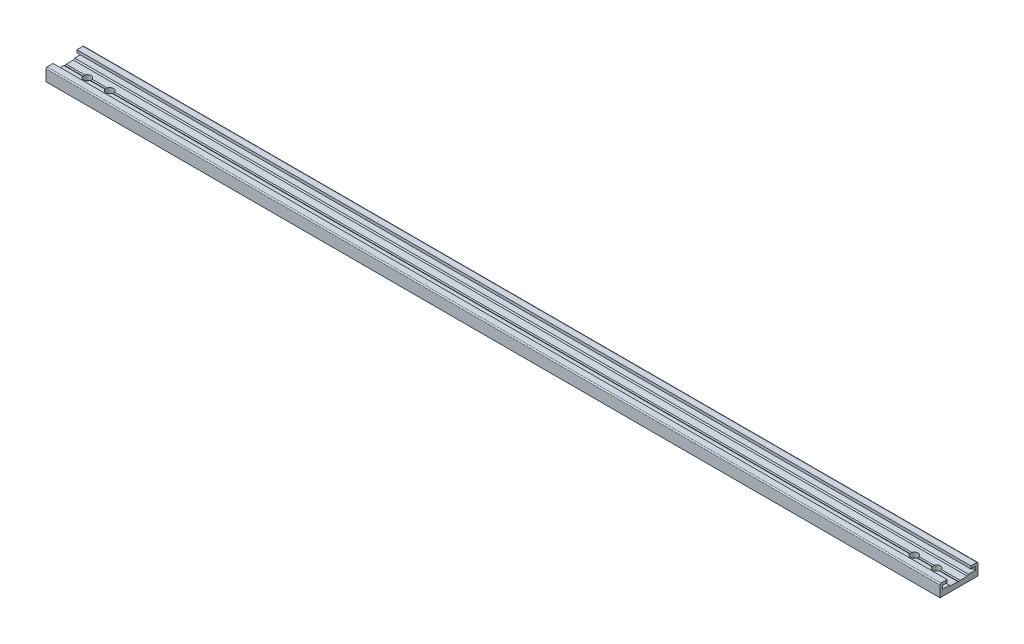
ISO-10303-21;
HEADER;
FILE_DESCRIPTION(('STEP AP214'),'2;1');
FILE_NAME('part.step','',(''),(''),'','','');
FILE_SCHEMA(('AUTOMOTIVE_DESIGN { 1 0 10303 214 1 1 1 1 }'));
ENDSEC;
DATA;
#1=APPLICATION_CONTEXT('core data for automotive mechanical design processes');
#2=APPLICATION_PROTOCOL_DEFINITION('international standard','automotive_design',2000,#1);
#3=PRODUCT_CONTEXT('',#1,'mechanical');
#4=PRODUCT('Part','Part','',(#3));
#5=PRODUCT_RELATED_PRODUCT_CATEGORY('part','',(#4));
#6=PRODUCT_DEFINITION_FORMATION('','',#4);
#7=PRODUCT_DEFINITION_CONTEXT('part definition',#1,'design');
#8=PRODUCT_DEFINITION('design','',#6,#7);
#9=PRODUCT_DEFINITION_SHAPE('','',#8);
#10=(LENGTH_UNIT() NAMED_UNIT(*) SI_UNIT(.MILLI.,.METRE.));
#11=(NAMED_UNIT(*) PLANE_ANGLE_UNIT() SI_UNIT($,.RADIAN.));
#12=(NAMED_UNIT(*) SI_UNIT($,.STERADIAN.) SOLID_ANGLE_UNIT());
#13=UNCERTAINTY_MEASURE_WITH_UNIT(LENGTH_MEASURE(1.E-05),#10,'distance_accuracy_value','');
#14=(GEOMETRIC_REPRESENTATION_CONTEXT(3) GLOBAL_UNCERTAINTY_ASSIGNED_CONTEXT((#13)) GLOBAL_UNIT_ASSIGNED_CONTEXT((#10,
#11,#12)) REPRESENTATION_CONTEXT('',''));
#15=CARTESIAN_POINT('',(0.,0.,0.));
#16=DIRECTION('',(0.,0.,1.));
#17=DIRECTION('',(1.,0.,0.));
#18=AXIS2_PLACEMENT_3D('',#15,#16,#17);
#19=CARTESIAN_POINT('',(400.,-0.45,-0.499999998010386));
#20=DIRECTION('',(0.,-0.866025403784438,-0.500000000000001));
#21=DIRECTION('',(0.,0.500000000000001,-0.866025403784438));
#22=AXIS2_PLACEMENT_3D('',#19,#20,#21);
#23=PLANE('',#22);
#24=DIRECTION('',(-1.,0.,0.));
#25=VECTOR('',#24,1.);
#26=CARTESIAN_POINT('',(400.,-0.738675133446109,0.));
#27=LINE('',#26,#25);
#28=CARTESIAN_POINT('',(388.3,-0.738675133446109,0.));
#29=VERTEX_POINT('',#28);
#30=CARTESIAN_POINT('',(381.7,-0.738675133446109,0.));
#31=VERTEX_POINT('',#30);
#32=EDGE_CURVE('E530',#29,#31,#27,.T.);
#33=ORIENTED_EDGE('',*,*,#32,.F.);
#34=CARTESIAN_POINT('',(390.,-0.738675133446109,0.));
#35=DIRECTION('',(0.,-0.866025403784438,-0.500000000000001));
#36=DIRECTION('',(0.,-0.500000000000001,0.866025403784438));
#37=AXIS2_PLACEMENT_3D('',#34,#35,#36);
#38=ELLIPSE('',#37,1.9629909152447,1.69999999999998);
#39=CARTESIAN_POINT('',(388.375192318461,-0.45,-0.499999998010386));
#40=VERTEX_POINT('',#39);
#41=EDGE_CURVE('E445',#29,#40,#38,.T.);
#42=ORIENTED_EDGE('',*,*,#41,.T.);
#43=DIRECTION('',(-1.,0.,0.));
#44=VECTOR('',#43,1.);
#45=CARTESIAN_POINT('',(400.,-0.45,-0.499999998010386));
#46=LINE('',#45,#44);
#47=CARTESIAN_POINT('',(381.624807681539,-0.45,-0.499999998010386));
#48=VERTEX_POINT('',#47);
#49=EDGE_CURVE('E520',#40,#48,#46,.T.);
#50=ORIENTED_EDGE('',*,*,#49,.T.);
#51=CARTESIAN_POINT('',(380.,-0.738675133446109,0.));
#52=DIRECTION('',(0.,-0.866025403784438,-0.500000000000001));
#53=DIRECTION('',(0.,-0.500000000000001,0.866025403784438));
#54=AXIS2_PLACEMENT_3D('',#51,#52,#53);
#55=ELLIPSE('',#54,1.9629909152447,1.69999999999998);
#56=EDGE_CURVE('E432',#48,#31,#55,.T.);
#57=ORIENTED_EDGE('',*,*,#56,.T.);
#58=EDGE_LOOP('',(#33,#42,#50,#57));
#59=FACE_BOUND('',#58,.T.);
#60=ADVANCED_FACE('F39',(#59),#23,.F.);
#61=CARTESIAN_POINT('',(400.,-0.45,0.499999998010387));
#62=DIRECTION('',(0.,-0.866025403784438,0.5));
#63=DIRECTION('',(0.,-0.5,-0.866025403784439));
#64=AXIS2_PLACEMENT_3D('',#61,#62,#63);
#65=PLANE('',#64);
#66=CARTESIAN_POINT('',(400.,-0.738675133446109,0.));
#67=VERTEX_POINT('',#66);
#68=CARTESIAN_POINT('',(391.7,-0.738675133446109,0.));
#69=VERTEX_POINT('',#68);
#70=EDGE_CURVE('E266',#67,#69,#27,.T.);
#71=ORIENTED_EDGE('',*,*,#70,.T.);
#72=CARTESIAN_POINT('',(390.,-0.738675133446109,0.));
#73=DIRECTION('',(0.,-0.866025403784438,0.5));
#74=DIRECTION('',(0.,-0.5,-0.866025403784439));
#75=AXIS2_PLACEMENT_3D('',#72,#73,#74);
#76=ELLIPSE('',#75,1.9629909152447,1.69999999999998);
#77=CARTESIAN_POINT('',(391.624807681539,-0.450000000000001,0.499999998010386));
#78=VERTEX_POINT('',#77);
#79=EDGE_CURVE('E253',#69,#78,#76,.T.);
#80=ORIENTED_EDGE('',*,*,#79,.T.);
#81=DIRECTION('',(-1.,0.,0.));
#82=VECTOR('',#81,1.);
#83=CARTESIAN_POINT('',(400.,-0.45,0.499999998010387));
#84=LINE('',#83,#82);
#85=CARTESIAN_POINT('',(400.,-0.45,0.499999998010387));
#86=VERTEX_POINT('',#85);
#87=EDGE_CURVE('E263',#86,#78,#84,.T.);
#88=ORIENTED_EDGE('',*,*,#87,.F.);
#89=DIRECTION('',(0.,0.5,0.866025403784438));
#90=VECTOR('',#89,1.);
#91=CARTESIAN_POINT('',(400.,-0.45,0.499999998010387));
#92=LINE('',#91,#90);
#93=EDGE_CURVE('E377',#67,#86,#92,.T.);
#94=ORIENTED_EDGE('',*,*,#93,.F.);
#95=EDGE_LOOP('',(#71,#80,#88,#94));
#96=FACE_BOUND('',#95,.T.);
#97=ADVANCED_FACE('F261',(#96),#65,.F.);
#98=CARTESIAN_POINT('',(388.375192318461,-0.450000000000001,0.499999998010386));
#99=VERTEX_POINT('',#98);
#100=CARTESIAN_POINT('',(381.624807681539,-0.450000000000001,0.499999998010386));
#101=VERTEX_POINT('',#100);
#102=EDGE_CURVE('E273',#99,#101,#84,.T.);
#103=ORIENTED_EDGE('',*,*,#102,.F.);
#104=EDGE_CURVE('E54',#99,#29,#76,.T.);
#105=ORIENTED_EDGE('',*,*,#104,.T.);
#106=ORIENTED_EDGE('',*,*,#32,.T.);
#107=CARTESIAN_POINT('',(380.,-0.738675133446109,0.));
#108=DIRECTION('',(0.,-0.866025403784438,0.5));
#109=DIRECTION('',(0.,-0.5,-0.866025403784439));
#110=AXIS2_PLACEMENT_3D('',#107,#108,#109);
#111=ELLIPSE('',#110,1.9629909152447,1.69999999999998);
#112=EDGE_CURVE('E435',#31,#101,#111,.T.);
#113=ORIENTED_EDGE('',*,*,#112,.T.);
#114=EDGE_LOOP('',(#103,#105,#106,#113));
#115=FACE_BOUND('',#114,.T.);
#116=ADVANCED_FACE('F576',(#115),#65,.F.);
#117=CARTESIAN_POINT('',(378.3,-0.738675133446109,0.));
#118=VERTEX_POINT('',#117);
#119=CARTESIAN_POINT('',(21.7000000000002,-0.738675133446109,0.));
#120=VERTEX_POINT('',#119);
#121=EDGE_CURVE('E278',#118,#120,#27,.T.);
#122=ORIENTED_EDGE('',*,*,#121,.F.);
#123=CARTESIAN_POINT('',(378.375192318461,-0.45,-0.499999998010386));
#124=VERTEX_POINT('',#123);
#125=EDGE_CURVE('E431',#118,#124,#55,.T.);
#126=ORIENTED_EDGE('',*,*,#125,.T.);
#127=CARTESIAN_POINT('',(21.6248076815395,-0.45,-0.499999998010385));
#128=VERTEX_POINT('',#127);
#129=EDGE_CURVE('E518',#124,#128,#46,.T.);
#130=ORIENTED_EDGE('',*,*,#129,.T.);
#131=CARTESIAN_POINT('',(20.,-0.73867513344611,0.));
#132=DIRECTION('',(0.,-0.866025403784438,-0.500000000000001));
#133=DIRECTION('',(0.,-0.500000000000001,0.866025403784438));
#134=AXIS2_PLACEMENT_3D('',#131,#132,#133);
#135=ELLIPSE('',#134,1.96299091524472,1.69999999999999);
#136=EDGE_CURVE('E362',#128,#120,#135,.T.);
#137=ORIENTED_EDGE('',*,*,#136,.T.);
#138=EDGE_LOOP('',(#122,#126,#130,#137));
#139=FACE_BOUND('',#138,.T.);
#140=ADVANCED_FACE('F515',(#139),#23,.F.);
#141=CARTESIAN_POINT('',(8.3000000000002,-0.738675133446109,0.));
#142=VERTEX_POINT('',#141);
#143=CARTESIAN_POINT('',(0.,-0.738675133446109,0.));
#144=VERTEX_POINT('',#143);
#145=EDGE_CURVE('E272',#142,#144,#27,.T.);
#146=ORIENTED_EDGE('',*,*,#145,.F.);
#147=CARTESIAN_POINT('',(10.,-0.738675133446109,0.));
#148=DIRECTION('',(0.,-0.866025403784438,-0.500000000000001));
#149=DIRECTION('',(0.,-0.500000000000001,0.866025403784438));
#150=AXIS2_PLACEMENT_3D('',#147,#148,#149);
#151=ELLIPSE('',#150,1.96299091524472,1.69999999999999);
#152=CARTESIAN_POINT('',(8.37519231846057,-0.45,-0.499999998010386));
#153=VERTEX_POINT('',#152);
#154=EDGE_CURVE('E417',#142,#153,#151,.T.);
#155=ORIENTED_EDGE('',*,*,#154,.T.);
#156=CARTESIAN_POINT('',(0.,-0.45,-0.499999998010386));
#157=VERTEX_POINT('',#156);
#158=EDGE_CURVE('E523',#153,#157,#46,.T.);
#159=ORIENTED_EDGE('',*,*,#158,.T.);
#160=DIRECTION('',(0.,-0.500000000000001,0.866025403784438));
#161=VECTOR('',#160,1.);
#162=CARTESIAN_POINT('',(0.,-0.45,-0.499999998010386));
#163=LINE('',#162,#161);
#164=EDGE_CURVE('E335',#157,#144,#163,.T.);
#165=ORIENTED_EDGE('',*,*,#164,.T.);
#166=EDGE_LOOP('',(#146,#155,#159,#165));
#167=FACE_BOUND('',#166,.T.);
#168=ADVANCED_FACE('F553',(#167),#23,.F.);
#169=CARTESIAN_POINT('',(18.3000000000002,-0.738675133446109,0.));
#170=VERTEX_POINT('',#169);
#171=CARTESIAN_POINT('',(11.7000000000002,-0.738675133446109,0.));
#172=VERTEX_POINT('',#171);
#173=EDGE_CURVE('E276',#170,#172,#27,.T.);
#174=ORIENTED_EDGE('',*,*,#173,.T.);
#175=CARTESIAN_POINT('',(10.,-0.738675133446109,0.));
#176=DIRECTION('',(0.,-0.866025403784438,0.5));
#177=DIRECTION('',(0.,-0.5,-0.866025403784439));
#178=AXIS2_PLACEMENT_3D('',#175,#176,#177);
#179=ELLIPSE('',#178,1.96299091524472,1.69999999999999);
#180=CARTESIAN_POINT('',(11.6248076815395,-0.450000000000001,0.499999998010386));
#181=VERTEX_POINT('',#180);
#182=EDGE_CURVE('E421',#172,#181,#179,.T.);
#183=ORIENTED_EDGE('',*,*,#182,.T.);
#184=CARTESIAN_POINT('',(18.3751923184607,-0.45,0.499999998010387));
#185=VERTEX_POINT('',#184);
#186=EDGE_CURVE('E275',#185,#181,#84,.T.);
#187=ORIENTED_EDGE('',*,*,#186,.F.);
#188=CARTESIAN_POINT('',(20.,-0.738675133446109,0.));
#189=DIRECTION('',(0.,-0.866025403784438,0.5));
#190=DIRECTION('',(0.,-0.5,-0.866025403784439));
#191=AXIS2_PLACEMENT_3D('',#188,#189,#190);
#192=ELLIPSE('',#191,1.96299091524472,1.69999999999999);
#193=EDGE_CURVE('E500',#185,#170,#192,.T.);
#194=ORIENTED_EDGE('',*,*,#193,.T.);
#195=EDGE_LOOP('',(#174,#183,#187,#194));
#196=FACE_BOUND('',#195,.T.);
#197=ADVANCED_FACE('F535',(#196),#65,.F.);
#198=CARTESIAN_POINT('',(18.3751923184606,-0.45,-0.499999998010386));
#199=VERTEX_POINT('',#198);
#200=CARTESIAN_POINT('',(11.6248076815395,-0.45,-0.499999998010386));
#201=VERTEX_POINT('',#200);
#202=EDGE_CURVE('E521',#199,#201,#46,.T.);
#203=ORIENTED_EDGE('',*,*,#202,.T.);
#204=EDGE_CURVE('E418',#201,#172,#151,.T.);
#205=ORIENTED_EDGE('',*,*,#204,.T.);
#206=ORIENTED_EDGE('',*,*,#173,.F.);
#207=EDGE_CURVE('E406',#170,#199,#135,.T.);
#208=ORIENTED_EDGE('',*,*,#207,.T.);
#209=EDGE_LOOP('',(#203,#205,#206,#208));
#210=FACE_BOUND('',#209,.T.);
#211=ADVANCED_FACE('F537',(#210),#23,.F.);
#212=CARTESIAN_POINT('',(378.375192318461,-0.450000000000001,0.499999998010386));
#213=VERTEX_POINT('',#212);
#214=CARTESIAN_POINT('',(21.6248076815395,-0.450000000000001,0.499999998010386));
#215=VERTEX_POINT('',#214);
#216=EDGE_CURVE('E279',#213,#215,#84,.T.);
#217=ORIENTED_EDGE('',*,*,#216,.F.);
#218=EDGE_CURVE('E61',#213,#118,#111,.T.);
#219=ORIENTED_EDGE('',*,*,#218,.T.);
#220=ORIENTED_EDGE('',*,*,#121,.T.);
#221=EDGE_CURVE('E502',#120,#215,#192,.T.);
#222=ORIENTED_EDGE('',*,*,#221,.T.);
#223=EDGE_LOOP('',(#217,#219,#220,#222));
#224=FACE_BOUND('',#223,.T.);
#225=ADVANCED_FACE('F507',(#224),#65,.F.);
#226=CARTESIAN_POINT('',(400.,-2.75,8.49999999602077));
#227=DIRECTION('',(0.,0.,-1.));
#228=DIRECTION('',(0.,1.,0.));
#229=AXIS2_PLACEMENT_3D('',#226,#227,#228);
#230=PLANE('',#229);
#231=DIRECTION('',(0.,-1.,0.));
#232=VECTOR('',#231,1.);
#233=CARTESIAN_POINT('',(0.,-2.75,8.49999999602077));
#234=LINE('',#233,#232);
#235=CARTESIAN_POINT('',(0.,2.25,8.49999999602078));
#236=VERTEX_POINT('',#235);
#237=CARTESIAN_POINT('',(0.,-2.75,8.49999999602077));
#238=VERTEX_POINT('',#237);
#239=EDGE_CURVE('E359',#236,#238,#234,.T.);
#240=ORIENTED_EDGE('',*,*,#239,.T.);
#241=DIRECTION('',(-1.,0.,0.));
#242=VECTOR('',#241,1.);
#243=CARTESIAN_POINT('',(400.,-2.75,8.49999999602077));
#244=LINE('',#243,#242);
#245=CARTESIAN_POINT('',(400.,-2.75,8.49999999602077));
#246=VERTEX_POINT('',#245);
#247=EDGE_CURVE('E468',#246,#238,#244,.T.);
#248=ORIENTED_EDGE('',*,*,#247,.F.);
#249=DIRECTION('',(0.,-1.,0.));
#250=VECTOR('',#249,1.);
#251=CARTESIAN_POINT('',(400.,-2.75,8.49999999602077));
#252=LINE('',#251,#250);
#253=CARTESIAN_POINT('',(400.,2.25,8.49999999602078));
#254=VERTEX_POINT('',#253);
#255=EDGE_CURVE('E318',#254,#246,#252,.T.);
#256=ORIENTED_EDGE('',*,*,#255,.F.);
#257=DIRECTION('',(-1.,0.,0.));
#258=VECTOR('',#257,1.);
#259=CARTESIAN_POINT('',(400.,2.25,8.49999999602078));
#260=LINE('',#259,#258);
#261=EDGE_CURVE('E312',#254,#236,#260,.T.);
#262=ORIENTED_EDGE('',*,*,#261,.T.);
#263=EDGE_LOOP('',(#240,#248,#256,#262));
#264=FACE_BOUND('',#263,.T.);
#265=ADVANCED_FACE('F41',(#264),#230,.F.);
#266=CARTESIAN_POINT('',(400.,-2.75,8.49999999602077));
#267=DIRECTION('',(0.,1.,0.));
#268=DIRECTION('',(0.,0.,1.));
#269=AXIS2_PLACEMENT_3D('',#266,#267,#268);
#270=PLANE('',#269);
#271=CARTESIAN_POINT('',(390.,-2.75,0.));
#272=DIRECTION('',(0.,-1.,0.));
#273=DIRECTION('',(0.,0.,-1.));
#274=AXIS2_PLACEMENT_3D('',#271,#272,#273);
#275=CIRCLE('',#274,1.69999999999998);
#276=CARTESIAN_POINT('',(390.,-2.75,-1.69999999999998));
#277=VERTEX_POINT('',#276);
#278=EDGE_CURVE('E447',#277,#277,#275,.T.);
#279=ORIENTED_EDGE('',*,*,#278,.F.);
#280=EDGE_LOOP('',(#279));
#281=FACE_BOUND('',#280,.T.);
#282=CARTESIAN_POINT('',(380.,-2.75,0.));
#283=DIRECTION('',(0.,-1.,0.));
#284=DIRECTION('',(0.,0.,-1.));
#285=AXIS2_PLACEMENT_3D('',#282,#283,#284);
#286=CIRCLE('',#285,1.69999999999998);
#287=CARTESIAN_POINT('',(380.,-2.75,-1.69999999999998));
#288=VERTEX_POINT('',#287);
#289=EDGE_CURVE('E439',#288,#288,#286,.T.);
#290=ORIENTED_EDGE('',*,*,#289,.F.);
#291=EDGE_LOOP('',(#290));
#292=FACE_BOUND('',#291,.T.);
#293=CARTESIAN_POINT('',(10.,-2.75,0.));
#294=DIRECTION('',(0.,-1.,0.));
#295=DIRECTION('',(0.,0.,-1.));
#296=AXIS2_PLACEMENT_3D('',#293,#294,#295);
#297=CIRCLE('',#296,1.69999999999999);
#298=CARTESIAN_POINT('',(10.,-2.75,-1.69999999999999));
#299=VERTEX_POINT('',#298);
#300=EDGE_CURVE('E425',#299,#299,#297,.T.);
#301=ORIENTED_EDGE('',*,*,#300,.F.);
#302=EDGE_LOOP('',(#301));
#303=FACE_BOUND('',#302,.T.);
#304=CARTESIAN_POINT('',(20.,-2.75,0.));
#305=DIRECTION('',(0.,-1.,0.));
#306=DIRECTION('',(0.,0.,-1.));
#307=AXIS2_PLACEMENT_3D('',#304,#305,#306);
#308=CIRCLE('',#307,1.69999999999999);
#309=CARTESIAN_POINT('',(20.,-2.75,-1.69999999999999));
#310=VERTEX_POINT('',#309);
#311=EDGE_CURVE('E411',#310,#310,#308,.T.);
#312=ORIENTED_EDGE('',*,*,#311,.F.);
#313=EDGE_LOOP('',(#312));
#314=FACE_BOUND('',#313,.T.);
#315=DIRECTION('',(0.,0.,-1.));
#316=VECTOR('',#315,1.);
#317=CARTESIAN_POINT('',(0.,-2.75,8.49999999602077));
#318=LINE('',#317,#316);
#319=CARTESIAN_POINT('',(0.,-2.75,-8.49999999602077));
#320=VERTEX_POINT('',#319);
#321=EDGE_CURVE('E357',#238,#320,#318,.T.);
#322=ORIENTED_EDGE('',*,*,#321,.T.);
#323=DIRECTION('',(-1.,0.,0.));
#324=VECTOR('',#323,1.);
#325=CARTESIAN_POINT('',(400.,-2.75,-8.49999999602077));
#326=LINE('',#325,#324);
#327=CARTESIAN_POINT('',(400.,-2.75,-8.49999999602077));
#328=VERTEX_POINT('',#327);
#329=EDGE_CURVE('E465',#328,#320,#326,.T.);
#330=ORIENTED_EDGE('',*,*,#329,.F.);
#331=DIRECTION('',(0.,0.,-1.));
#332=VECTOR('',#331,1.);
#333=CARTESIAN_POINT('',(400.,-2.75,8.49999999602077));
#334=LINE('',#333,#332);
#335=EDGE_CURVE('E399',#246,#328,#334,.T.);
#336=ORIENTED_EDGE('',*,*,#335,.F.);
#337=ORIENTED_EDGE('',*,*,#247,.T.);
#338=EDGE_LOOP('',(#322,#330,#336,#337));
#339=FACE_BOUND('',#338,.T.);
#340=ADVANCED_FACE('F452',(#281,#292,#303,#314,#339),#270,.F.);
#341=CARTESIAN_POINT('',(400.,-2.75,-8.49999999602077));
#342=DIRECTION('',(0.,0.,1.));
#343=DIRECTION('',(1.,0.,0.));
#344=AXIS2_PLACEMENT_3D('',#341,#342,#343);
#345=PLANE('',#344);
#346=DIRECTION('',(0.,1.,0.));
#347=VECTOR('',#346,1.);
#348=CARTESIAN_POINT('',(0.,-2.75,-8.49999999602077));
#349=LINE('',#348,#347);
#350=CARTESIAN_POINT('',(0.,2.25,-8.49999999602077));
#351=VERTEX_POINT('',#350);
#352=EDGE_CURVE('E355',#320,#351,#349,.T.);
#353=ORIENTED_EDGE('',*,*,#352,.T.);
#354=DIRECTION('',(-1.,0.,0.));
#355=VECTOR('',#354,1.);
#356=CARTESIAN_POINT('',(400.,2.25,-8.49999999602077));
#357=LINE('',#356,#355);
#358=CARTESIAN_POINT('',(400.,2.25,-8.49999999602077));
#359=VERTEX_POINT('',#358);
#360=EDGE_CURVE('E475',#359,#351,#357,.T.);
#361=ORIENTED_EDGE('',*,*,#360,.F.);
#362=DIRECTION('',(0.,1.,0.));
#363=VECTOR('',#362,1.);
#364=CARTESIAN_POINT('',(400.,-2.75,-8.49999999602077));
#365=LINE('',#364,#363);
#366=EDGE_CURVE('E397',#328,#359,#365,.T.);
#367=ORIENTED_EDGE('',*,*,#366,.F.);
#368=ORIENTED_EDGE('',*,*,#329,.T.);
#369=EDGE_LOOP('',(#353,#361,#367,#368));
#370=FACE_BOUND('',#369,.T.);
#371=ADVANCED_FACE('F455',(#370),#345,.F.);
#372=CARTESIAN_POINT('',(400.,2.25,-7.99999999602077));
#373=DIRECTION('',(-1.,0.,0.));
#374=DIRECTION('',(0.,0.,1.));
#375=AXIS2_PLACEMENT_3D('',#372,#373,#374);
#376=CYLINDRICAL_SURFACE('',#375,0.5);
#377=CARTESIAN_POINT('',(0.,2.25,-7.99999999602077));
#378=DIRECTION('',(1.,0.,0.));
#379=DIRECTION('',(0.,0.,-1.));
#380=AXIS2_PLACEMENT_3D('',#377,#378,#379);
#381=CIRCLE('',#380,0.5);
#382=CARTESIAN_POINT('',(0.,2.75,-7.99999999602077));
#383=VERTEX_POINT('',#382);
#384=EDGE_CURVE('E353',#351,#383,#381,.T.);
#385=ORIENTED_EDGE('',*,*,#384,.T.);
#386=DIRECTION('',(-1.,0.,0.));
#387=VECTOR('',#386,1.);
#388=CARTESIAN_POINT('',(400.,2.75,-7.99999999602077));
#389=LINE('',#388,#387);
#390=CARTESIAN_POINT('',(400.,2.75,-7.99999999602077));
#391=VERTEX_POINT('',#390);
#392=EDGE_CURVE('E486',#391,#383,#389,.T.);
#393=ORIENTED_EDGE('',*,*,#392,.F.);
#394=CARTESIAN_POINT('',(400.,2.25,-7.99999999602077));
#395=DIRECTION('',(1.,0.,0.));
#396=DIRECTION('',(0.,0.,-1.));
#397=AXIS2_PLACEMENT_3D('',#394,#395,#396);
#398=CIRCLE('',#397,0.5);
#399=EDGE_CURVE('E395',#359,#391,#398,.T.);
#400=ORIENTED_EDGE('',*,*,#399,.F.);
#401=ORIENTED_EDGE('',*,*,#360,.T.);
#402=EDGE_LOOP('',(#385,#393,#400,#401));
#403=FACE_BOUND('',#402,.T.);
#404=ADVANCED_FACE('F484',(#403),#376,.T.);
#405=CARTESIAN_POINT('',(400.,2.75,-7.99999999602077));
#406=DIRECTION('',(0.,-1.,0.));
#407=DIRECTION('',(0.,0.,-1.));
#408=AXIS2_PLACEMENT_3D('',#405,#406,#407);
#409=PLANE('',#408);
#410=DIRECTION('',(0.,0.,1.));
#411=VECTOR('',#410,1.);
#412=CARTESIAN_POINT('',(0.,2.75,-7.99999999602077));
#413=LINE('',#412,#411);
#414=CARTESIAN_POINT('',(0.,2.75,-5.29999999602078));
#415=VERTEX_POINT('',#414);
#416=EDGE_CURVE('E351',#383,#415,#413,.T.);
#417=ORIENTED_EDGE('',*,*,#416,.T.);
#418=DIRECTION('',(-1.,0.,0.));
#419=VECTOR('',#418,1.);
#420=CARTESIAN_POINT('',(400.,2.75,-5.29999999602078));
#421=LINE('',#420,#419);
#422=CARTESIAN_POINT('',(400.,2.75,-5.29999999602078));
#423=VERTEX_POINT('',#422);
#424=EDGE_CURVE('E492',#423,#415,#421,.T.);
#425=ORIENTED_EDGE('',*,*,#424,.F.);
#426=DIRECTION('',(0.,0.,1.));
#427=VECTOR('',#426,1.);
#428=CARTESIAN_POINT('',(400.,2.75,-7.99999999602077));
#429=LINE('',#428,#427);
#430=EDGE_CURVE('E393',#391,#423,#429,.T.);
#431=ORIENTED_EDGE('',*,*,#430,.F.);
#432=ORIENTED_EDGE('',*,*,#392,.T.);
#433=EDGE_LOOP('',(#417,#425,#431,#432));
#434=FACE_BOUND('',#433,.T.);
#435=ADVANCED_FACE('F489',(#434),#409,.F.);
#436=CARTESIAN_POINT('',(400.,2.75,-5.29999999602078));
#437=DIRECTION('',(0.,0.,-1.));
#438=DIRECTION('',(0.,1.,0.));
#439=AXIS2_PLACEMENT_3D('',#436,#437,#438);
#440=PLANE('',#439);
#441=DIRECTION('',(0.,-1.,0.));
#442=VECTOR('',#441,1.);
#443=CARTESIAN_POINT('',(0.,2.75,-5.29999999602078));
#444=LINE('',#443,#442);
#445=CARTESIAN_POINT('',(0.,1.55,-5.29999999602078));
#446=VERTEX_POINT('',#445);
#447=EDGE_CURVE('E349',#415,#446,#444,.T.);
#448=ORIENTED_EDGE('',*,*,#447,.T.);
#449=DIRECTION('',(-1.,0.,0.));
#450=VECTOR('',#449,1.);
#451=CARTESIAN_POINT('',(400.,1.55,-5.29999999602078));
#452=LINE('',#451,#450);
#453=CARTESIAN_POINT('',(400.,1.55,-5.29999999602078));
#454=VERTEX_POINT('',#453);
#455=EDGE_CURVE('E495',#454,#446,#452,.T.);
#456=ORIENTED_EDGE('',*,*,#455,.F.);
#457=DIRECTION('',(0.,-1.,0.));
#458=VECTOR('',#457,1.);
#459=CARTESIAN_POINT('',(400.,2.75,-5.29999999602078));
#460=LINE('',#459,#458);
#461=EDGE_CURVE('E391',#423,#454,#460,.T.);
#462=ORIENTED_EDGE('',*,*,#461,.F.);
#463=ORIENTED_EDGE('',*,*,#424,.T.);
#464=EDGE_LOOP('',(#448,#456,#462,#463));
#465=FACE_BOUND('',#464,.T.);
#466=ADVANCED_FACE('F753',(#465),#440,.F.);
#467=CARTESIAN_POINT('',(400.,1.55,-5.29999999602078));
#468=DIRECTION('',(0.,1.,0.));
#469=DIRECTION('',(0.,0.,1.));
#470=AXIS2_PLACEMENT_3D('',#467,#468,#469);
#471=PLANE('',#470);
#472=DIRECTION('',(0.,0.,-1.));
#473=VECTOR('',#472,1.);
#474=CARTESIAN_POINT('',(0.,1.55,-5.29999999602078));
#475=LINE('',#474,#473);
#476=CARTESIAN_POINT('',(0.,1.55,-7.29999999801039));
#477=VERTEX_POINT('',#476);
#478=EDGE_CURVE('E347',#446,#477,#475,.T.);
#479=ORIENTED_EDGE('',*,*,#478,.T.);
#480=DIRECTION('',(-1.,0.,0.));
#481=VECTOR('',#480,1.);
#482=CARTESIAN_POINT('',(400.,1.55,-7.29999999801039));
#483=LINE('',#482,#481);
#484=CARTESIAN_POINT('',(400.,1.55,-7.29999999801039));
#485=VERTEX_POINT('',#484);
#486=EDGE_CURVE('E817',#485,#477,#483,.T.);
#487=ORIENTED_EDGE('',*,*,#486,.F.);
#488=DIRECTION('',(0.,0.,-1.));
#489=VECTOR('',#488,1.);
#490=CARTESIAN_POINT('',(400.,1.55,-5.29999999602078));
#491=LINE('',#490,#489);
#492=EDGE_CURVE('E389',#454,#485,#491,.T.);
#493=ORIENTED_EDGE('',*,*,#492,.F.);
#494=ORIENTED_EDGE('',*,*,#455,.T.);
#495=EDGE_LOOP('',(#479,#487,#493,#494));
#496=FACE_BOUND('',#495,.T.);
#497=ADVANCED_FACE('F745',(#496),#471,.F.);
#498=CARTESIAN_POINT('',(400.,1.55,-7.29999999801039));
#499=DIRECTION('',(0.,0.,-1.));
#500=DIRECTION('',(0.,1.,0.));
#501=AXIS2_PLACEMENT_3D('',#498,#499,#500);
#502=PLANE('',#501);
#503=DIRECTION('',(0.,-1.,0.));
#504=VECTOR('',#503,1.);
#505=CARTESIAN_POINT('',(0.,1.55,-7.29999999801039));
#506=LINE('',#505,#504);
#507=CARTESIAN_POINT('',(0.,0.0500000000000036,-7.29999999801039));
#508=VERTEX_POINT('',#507);
#509=EDGE_CURVE('E345',#477,#508,#506,.T.);
#510=ORIENTED_EDGE('',*,*,#509,.T.);
#511=DIRECTION('',(-1.,0.,0.));
#512=VECTOR('',#511,1.);
#513=CARTESIAN_POINT('',(400.,0.0500000000000036,-7.29999999801039));
#514=LINE('',#513,#512);
#515=CARTESIAN_POINT('',(400.,0.0500000000000036,-7.29999999801039));
#516=VERTEX_POINT('',#515);
#517=EDGE_CURVE('E825',#516,#508,#514,.T.);
#518=ORIENTED_EDGE('',*,*,#517,.F.);
#519=DIRECTION('',(0.,-1.,0.));
#520=VECTOR('',#519,1.);
#521=CARTESIAN_POINT('',(400.,1.55,-7.29999999801039));
#522=LINE('',#521,#520);
#523=EDGE_CURVE('E387',#485,#516,#522,.T.);
#524=ORIENTED_EDGE('',*,*,#523,.F.);
#525=ORIENTED_EDGE('',*,*,#486,.T.);
#526=EDGE_LOOP('',(#510,#518,#524,#525));
#527=FACE_BOUND('',#526,.T.);
#528=ADVANCED_FACE('F737',(#527),#502,.F.);
#529=CARTESIAN_POINT('',(400.,0.0500000000000036,-7.29999999801039));
#530=DIRECTION('',(0.,-1.,0.));
#531=DIRECTION('',(0.,0.,-1.));
#532=AXIS2_PLACEMENT_3D('',#529,#530,#531);
#533=PLANE('',#532);
#534=DIRECTION('',(0.,0.,1.));
#535=VECTOR('',#534,1.);
#536=CARTESIAN_POINT('',(0.,0.0500000000000036,-7.29999999801039));
#537=LINE('',#536,#535);
#538=CARTESIAN_POINT('',(0.,0.0500000000000001,-4.24999999801039));
#539=VERTEX_POINT('',#538);
#540=EDGE_CURVE('E343',#508,#539,#537,.T.);
#541=ORIENTED_EDGE('',*,*,#540,.T.);
#542=DIRECTION('',(-1.,0.,0.));
#543=VECTOR('',#542,1.);
#544=CARTESIAN_POINT('',(400.,0.0500000000000001,-4.24999999801039));
#545=LINE('',#544,#543);
#546=CARTESIAN_POINT('',(400.,0.0500000000000001,-4.24999999801039));
#547=VERTEX_POINT('',#546);
#548=EDGE_CURVE('E828',#547,#539,#545,.T.);
#549=ORIENTED_EDGE('',*,*,#548,.F.);
#550=DIRECTION('',(0.,0.,1.));
#551=VECTOR('',#550,1.);
#552=CARTESIAN_POINT('',(400.,0.0500000000000036,-7.29999999801039));
#553=LINE('',#552,#551);
#554=EDGE_CURVE('E385',#516,#547,#553,.T.);
#555=ORIENTED_EDGE('',*,*,#554,.F.);
#556=ORIENTED_EDGE('',*,*,#517,.T.);
#557=EDGE_LOOP('',(#541,#549,#555,#556));
#558=FACE_BOUND('',#557,.T.);
#559=ADVANCED_FACE('F729',(#558),#533,.F.);
#560=CARTESIAN_POINT('',(400.,0.0500000000000001,-4.24999999801039));
#561=DIRECTION('',(0.,-0.707106781186548,-0.707106781186548));
#562=DIRECTION('',(0.,0.707106781186548,-0.707106781186548));
#563=AXIS2_PLACEMENT_3D('',#560,#561,#562);
#564=PLANE('',#563);
#565=DIRECTION('',(0.,-0.707106781186548,0.707106781186548));
#566=VECTOR('',#565,1.);
#567=CARTESIAN_POINT('',(0.,0.0500000000000001,-4.24999999801039));
#568=LINE('',#567,#566);
#569=CARTESIAN_POINT('',(0.,-0.45,-3.74999999801039));
#570=VERTEX_POINT('',#569);
#571=EDGE_CURVE('E341',#539,#570,#568,.T.);
#572=ORIENTED_EDGE('',*,*,#571,.T.);
#573=DIRECTION('',(-1.,0.,0.));
#574=VECTOR('',#573,1.);
#575=CARTESIAN_POINT('',(400.,-0.45,-3.74999999801039));
#576=LINE('',#575,#574);
#577=CARTESIAN_POINT('',(400.,-0.45,-3.74999999801039));
#578=VERTEX_POINT('',#577);
#579=EDGE_CURVE('E548',#578,#570,#576,.T.);
#580=ORIENTED_EDGE('',*,*,#579,.F.);
#581=DIRECTION('',(0.,-0.707106781186548,0.707106781186548));
#582=VECTOR('',#581,1.);
#583=CARTESIAN_POINT('',(400.,0.0500000000000001,-4.24999999801039));
#584=LINE('',#583,#582);
#585=EDGE_CURVE('E383',#547,#578,#584,.T.);
#586=ORIENTED_EDGE('',*,*,#585,.F.);
#587=ORIENTED_EDGE('',*,*,#548,.T.);
#588=EDGE_LOOP('',(#572,#580,#586,#587));
#589=FACE_BOUND('',#588,.T.);
#590=ADVANCED_FACE('F596',(#589),#564,.F.);
#591=CARTESIAN_POINT('',(400.,-0.45,-3.74999999801039));
#592=DIRECTION('',(0.,-1.,0.));
#593=DIRECTION('',(0.,0.,-1.));
#594=AXIS2_PLACEMENT_3D('',#591,#592,#593);
#595=PLANE('',#594);
#596=ORIENTED_EDGE('',*,*,#49,.F.);
#597=CARTESIAN_POINT('',(390.,-0.45,0.));
#598=DIRECTION('',(0.,-1.,0.));
#599=DIRECTION('',(0.,0.,-1.));
#600=AXIS2_PLACEMENT_3D('',#597,#598,#599);
#601=CIRCLE('',#600,1.69999999999998);
#602=CARTESIAN_POINT('',(391.624807681539,-0.45,-0.499999998010386));
#603=VERTEX_POINT('',#602);
#604=EDGE_CURVE('E442',#40,#603,#601,.T.);
#605=ORIENTED_EDGE('',*,*,#604,.T.);
#606=CARTESIAN_POINT('',(400.,-0.45,-0.499999998010386));
#607=VERTEX_POINT('',#606);
#608=EDGE_CURVE('E524',#607,#603,#46,.T.);
#609=ORIENTED_EDGE('',*,*,#608,.F.);
#610=DIRECTION('',(0.,0.,1.));
#611=VECTOR('',#610,1.);
#612=CARTESIAN_POINT('',(400.,-0.45,-3.74999999801039));
#613=LINE('',#612,#611);
#614=EDGE_CURVE('E381',#578,#607,#613,.T.);
#615=ORIENTED_EDGE('',*,*,#614,.F.);
#616=ORIENTED_EDGE('',*,*,#579,.T.);
#617=DIRECTION('',(0.,0.,1.));
#618=VECTOR('',#617,1.);
#619=CARTESIAN_POINT('',(0.,-0.45,-3.74999999801039));
#620=LINE('',#619,#618);
#621=EDGE_CURVE('E338',#570,#157,#620,.T.);
#622=ORIENTED_EDGE('',*,*,#621,.T.);
#623=ORIENTED_EDGE('',*,*,#158,.F.);
#624=CARTESIAN_POINT('',(10.,-0.45,0.));
#625=DIRECTION('',(0.,-1.,0.));
#626=DIRECTION('',(0.,0.,-1.));
#627=AXIS2_PLACEMENT_3D('',#624,#625,#626);
#628=CIRCLE('',#627,1.69999999999999);
#629=EDGE_CURVE('E414',#153,#201,#628,.T.);
#630=ORIENTED_EDGE('',*,*,#629,.T.);
#631=ORIENTED_EDGE('',*,*,#202,.F.);
#632=CARTESIAN_POINT('',(20.,-0.45,0.));
#633=DIRECTION('',(0.,-1.,0.));
#634=DIRECTION('',(0.,0.,-1.));
#635=AXIS2_PLACEMENT_3D('',#632,#633,#634);
#636=CIRCLE('',#635,1.69999999999999);
#637=EDGE_CURVE('E403',#199,#128,#636,.T.);
#638=ORIENTED_EDGE('',*,*,#637,.T.);
#639=ORIENTED_EDGE('',*,*,#129,.F.);
#640=CARTESIAN_POINT('',(380.,-0.45,0.));
#641=DIRECTION('',(0.,-1.,0.));
#642=DIRECTION('',(0.,0.,-1.));
#643=AXIS2_PLACEMENT_3D('',#640,#641,#642);
#644=CIRCLE('',#643,1.69999999999998);
#645=EDGE_CURVE('E428',#124,#48,#644,.T.);
#646=ORIENTED_EDGE('',*,*,#645,.T.);
#647=EDGE_LOOP('',(#596,#605,#609,#615,#616,#622,#623,#630,#631,#638,#639,#646));
#648=FACE_BOUND('',#647,.T.);
#649=ADVANCED_FACE('F542',(#648),#595,.F.);
#650=ORIENTED_EDGE('',*,*,#608,.T.);
#651=EDGE_CURVE('E267',#603,#69,#38,.T.);
#652=ORIENTED_EDGE('',*,*,#651,.T.);
#653=ORIENTED_EDGE('',*,*,#70,.F.);
#654=DIRECTION('',(0.,-0.500000000000001,0.866025403784438));
#655=VECTOR('',#654,1.);
#656=CARTESIAN_POINT('',(400.,-0.45,-0.499999998010386));
#657=LINE('',#656,#655);
#658=EDGE_CURVE('E379',#607,#67,#657,.T.);
#659=ORIENTED_EDGE('',*,*,#658,.F.);
#660=EDGE_LOOP('',(#650,#652,#653,#659));
#661=FACE_BOUND('',#660,.T.);
#662=ADVANCED_FACE('F567',(#661),#23,.F.);
#663=CARTESIAN_POINT('',(8.37519231846056,-0.450000000000001,0.499999998010386));
#664=VERTEX_POINT('',#663);
#665=CARTESIAN_POINT('',(0.,-0.45,0.499999998010387));
#666=VERTEX_POINT('',#665);
#667=EDGE_CURVE('E282',#664,#666,#84,.T.);
#668=ORIENTED_EDGE('',*,*,#667,.F.);
#669=EDGE_CURVE('E422',#664,#142,#179,.T.);
#670=ORIENTED_EDGE('',*,*,#669,.T.);
#671=ORIENTED_EDGE('',*,*,#145,.T.);
#672=DIRECTION('',(0.,0.5,0.866025403784438));
#673=VECTOR('',#672,1.);
#674=CARTESIAN_POINT('',(0.,-0.45,0.499999998010387));
#675=LINE('',#674,#673);
#676=EDGE_CURVE('E333',#144,#666,#675,.T.);
#677=ORIENTED_EDGE('',*,*,#676,.T.);
#678=EDGE_LOOP('',(#668,#670,#671,#677));
#679=FACE_BOUND('',#678,.T.);
#680=ADVANCED_FACE('F555',(#679),#65,.F.);
#681=CARTESIAN_POINT('',(400.,-0.450000000000002,3.74999999801039));
#682=DIRECTION('',(0.,-1.,0.));
#683=DIRECTION('',(0.,0.,-1.));
#684=AXIS2_PLACEMENT_3D('',#681,#682,#683);
#685=PLANE('',#684);
#686=ORIENTED_EDGE('',*,*,#87,.T.);
#687=CARTESIAN_POINT('',(390.,-0.45,0.));
#688=DIRECTION('',(0.,-1.,0.));
#689=DIRECTION('',(0.,0.,-1.));
#690=AXIS2_PLACEMENT_3D('',#687,#688,#689);
#691=CIRCLE('',#690,1.69999999999998);
#692=EDGE_CURVE('E11',#78,#99,#691,.T.);
#693=ORIENTED_EDGE('',*,*,#692,.T.);
#694=ORIENTED_EDGE('',*,*,#102,.T.);
#695=CARTESIAN_POINT('',(380.,-0.45,0.));
#696=DIRECTION('',(0.,-1.,0.));
#697=DIRECTION('',(0.,0.,-1.));
#698=AXIS2_PLACEMENT_3D('',#695,#696,#697);
#699=CIRCLE('',#698,1.69999999999998);
#700=EDGE_CURVE('E437',#101,#213,#699,.T.);
#701=ORIENTED_EDGE('',*,*,#700,.T.);
#702=ORIENTED_EDGE('',*,*,#216,.T.);
#703=CARTESIAN_POINT('',(20.,-0.45,0.));
#704=DIRECTION('',(0.,-1.,0.));
#705=DIRECTION('',(0.,0.,-1.));
#706=AXIS2_PLACEMENT_3D('',#703,#704,#705);
#707=CIRCLE('',#706,1.69999999999999);
#708=EDGE_CURVE('E409',#215,#185,#707,.T.);
#709=ORIENTED_EDGE('',*,*,#708,.T.);
#710=ORIENTED_EDGE('',*,*,#186,.T.);
#711=CARTESIAN_POINT('',(10.,-0.45,0.));
#712=DIRECTION('',(0.,-1.,0.));
#713=DIRECTION('',(0.,0.,-1.));
#714=AXIS2_PLACEMENT_3D('',#711,#712,#713);
#715=CIRCLE('',#714,1.69999999999999);
#716=EDGE_CURVE('E47',#181,#664,#715,.T.);
#717=ORIENTED_EDGE('',*,*,#716,.T.);
#718=ORIENTED_EDGE('',*,*,#667,.T.);
#719=DIRECTION('',(0.,0.,1.));
#720=VECTOR('',#719,1.);
#721=CARTESIAN_POINT('',(0.,-0.450000000000002,3.74999999801039));
#722=LINE('',#721,#720);
#723=CARTESIAN_POINT('',(0.,-0.450000000000002,3.74999999801039));
#724=VERTEX_POINT('',#723);
#725=EDGE_CURVE('E331',#666,#724,#722,.T.);
#726=ORIENTED_EDGE('',*,*,#725,.T.);
#727=DIRECTION('',(-1.,0.,0.));
#728=VECTOR('',#727,1.);
#729=CARTESIAN_POINT('',(400.,-0.450000000000002,3.74999999801039));
#730=LINE('',#729,#728);
#731=CARTESIAN_POINT('',(400.,-0.450000000000002,3.74999999801039));
#732=VERTEX_POINT('',#731);
#733=EDGE_CURVE('E286',#732,#724,#730,.T.);
#734=ORIENTED_EDGE('',*,*,#733,.F.);
#735=DIRECTION('',(0.,0.,1.));
#736=VECTOR('',#735,1.);
#737=CARTESIAN_POINT('',(400.,-0.450000000000002,3.74999999801039));
#738=LINE('',#737,#736);
#739=EDGE_CURVE('E271',#86,#732,#738,.T.);
#740=ORIENTED_EDGE('',*,*,#739,.F.);
#741=EDGE_LOOP('',(#686,#693,#694,#701,#702,#709,#710,#717,#718,#726,#734,#740));
#742=FACE_BOUND('',#741,.T.);
#743=ADVANCED_FACE('F269',(#742),#685,.F.);
#744=CARTESIAN_POINT('',(400.,0.0499999999999984,4.24999999801039));
#745=DIRECTION('',(0.,-0.707106781186548,0.707106781186547));
#746=DIRECTION('',(0.,-0.707106781186547,-0.707106781186548));
#747=AXIS2_PLACEMENT_3D('',#744,#745,#746);
#748=PLANE('',#747);
#749=DIRECTION('',(0.,0.707106781186547,0.707106781186548));
#750=VECTOR('',#749,1.);
#751=CARTESIAN_POINT('',(0.,0.0499999999999984,4.24999999801039));
#752=LINE('',#751,#750);
#753=CARTESIAN_POINT('',(0.,0.0499999999999984,4.24999999801039));
#754=VERTEX_POINT('',#753);
#755=EDGE_CURVE('E329',#724,#754,#752,.T.);
#756=ORIENTED_EDGE('',*,*,#755,.T.);
#757=DIRECTION('',(-1.,0.,0.));
#758=VECTOR('',#757,1.);
#759=CARTESIAN_POINT('',(400.,0.0499999999999984,4.24999999801039));
#760=LINE('',#759,#758);
#761=CARTESIAN_POINT('',(400.,0.0499999999999984,4.24999999801039));
#762=VERTEX_POINT('',#761);
#763=EDGE_CURVE('E290',#762,#754,#760,.T.);
#764=ORIENTED_EDGE('',*,*,#763,.F.);
#765=DIRECTION('',(0.,0.707106781186547,0.707106781186548));
#766=VECTOR('',#765,1.);
#767=CARTESIAN_POINT('',(400.,0.0499999999999984,4.24999999801039));
#768=LINE('',#767,#766);
#769=EDGE_CURVE('E374',#732,#762,#768,.T.);
#770=ORIENTED_EDGE('',*,*,#769,.F.);
#771=ORIENTED_EDGE('',*,*,#733,.T.);
#772=EDGE_LOOP('',(#756,#764,#770,#771));
#773=FACE_BOUND('',#772,.T.);
#774=ADVANCED_FACE('F558',(#773),#748,.F.);
#775=CARTESIAN_POINT('',(400.,0.050000000000001,7.29999999801039));
#776=DIRECTION('',(0.,-1.,0.));
#777=DIRECTION('',(0.,0.,-1.));
#778=AXIS2_PLACEMENT_3D('',#775,#776,#777);
#779=PLANE('',#778);
#780=DIRECTION('',(0.,0.,1.));
#781=VECTOR('',#780,1.);
#782=CARTESIAN_POINT('',(0.,0.050000000000001,7.29999999801039));
#783=LINE('',#782,#781);
#784=CARTESIAN_POINT('',(0.,0.050000000000001,7.29999999801039));
#785=VERTEX_POINT('',#784);
#786=EDGE_CURVE('E327',#754,#785,#783,.T.);
#787=ORIENTED_EDGE('',*,*,#786,.T.);
#788=DIRECTION('',(-1.,0.,0.));
#789=VECTOR('',#788,1.);
#790=CARTESIAN_POINT('',(400.,0.050000000000001,7.29999999801039));
#791=LINE('',#790,#789);
#792=CARTESIAN_POINT('',(400.,0.050000000000001,7.29999999801039));
#793=VERTEX_POINT('',#792);
#794=EDGE_CURVE('E295',#793,#785,#791,.T.);
#795=ORIENTED_EDGE('',*,*,#794,.F.);
#796=DIRECTION('',(0.,0.,1.));
#797=VECTOR('',#796,1.);
#798=CARTESIAN_POINT('',(400.,0.050000000000001,7.29999999801039));
#799=LINE('',#798,#797);
#800=EDGE_CURVE('E372',#762,#793,#799,.T.);
#801=ORIENTED_EDGE('',*,*,#800,.F.);
#802=ORIENTED_EDGE('',*,*,#763,.T.);
#803=EDGE_LOOP('',(#787,#795,#801,#802));
#804=FACE_BOUND('',#803,.T.);
#805=ADVANCED_FACE('F698',(#804),#779,.F.);
#806=CARTESIAN_POINT('',(400.,1.55,7.29999999801039));
#807=DIRECTION('',(0.,0.,1.));
#808=DIRECTION('',(0.,-1.,0.));
#809=AXIS2_PLACEMENT_3D('',#806,#807,#808);
#810=PLANE('',#809);
#811=DIRECTION('',(0.,1.,0.));
#812=VECTOR('',#811,1.);
#813=CARTESIAN_POINT('',(0.,1.55,7.29999999801039));
#814=LINE('',#813,#812);
#815=CARTESIAN_POINT('',(0.,1.55,7.29999999801039));
#816=VERTEX_POINT('',#815);
#817=EDGE_CURVE('E325',#785,#816,#814,.T.);
#818=ORIENTED_EDGE('',*,*,#817,.T.);
#819=DIRECTION('',(-1.,0.,0.));
#820=VECTOR('',#819,1.);
#821=CARTESIAN_POINT('',(400.,1.55,7.29999999801039));
#822=LINE('',#821,#820);
#823=CARTESIAN_POINT('',(400.,1.55,7.29999999801039));
#824=VERTEX_POINT('',#823);
#825=EDGE_CURVE('E300',#824,#816,#822,.T.);
#826=ORIENTED_EDGE('',*,*,#825,.F.);
#827=DIRECTION('',(0.,1.,0.));
#828=VECTOR('',#827,1.);
#829=CARTESIAN_POINT('',(400.,1.55,7.29999999801039));
#830=LINE('',#829,#828);
#831=EDGE_CURVE('E370',#793,#824,#830,.T.);
#832=ORIENTED_EDGE('',*,*,#831,.F.);
#833=ORIENTED_EDGE('',*,*,#794,.T.);
#834=EDGE_LOOP('',(#818,#826,#832,#833));
#835=FACE_BOUND('',#834,.T.);
#836=ADVANCED_FACE('F694',(#835),#810,.F.);
#837=CARTESIAN_POINT('',(400.,1.55,5.29999999602078));
#838=DIRECTION('',(0.,1.,0.));
#839=DIRECTION('',(0.,0.,1.));
#840=AXIS2_PLACEMENT_3D('',#837,#838,#839);
#841=PLANE('',#840);
#842=DIRECTION('',(0.,0.,-1.));
#843=VECTOR('',#842,1.);
#844=CARTESIAN_POINT('',(0.,1.55,5.29999999602078));
#845=LINE('',#844,#843);
#846=CARTESIAN_POINT('',(0.,1.55,5.29999999602078));
#847=VERTEX_POINT('',#846);
#848=EDGE_CURVE('E323',#816,#847,#845,.T.);
#849=ORIENTED_EDGE('',*,*,#848,.T.);
#850=DIRECTION('',(-1.,0.,0.));
#851=VECTOR('',#850,1.);
#852=CARTESIAN_POINT('',(400.,1.55,5.29999999602078));
#853=LINE('',#852,#851);
#854=CARTESIAN_POINT('',(400.,1.55,5.29999999602078));
#855=VERTEX_POINT('',#854);
#856=EDGE_CURVE('E303',#855,#847,#853,.T.);
#857=ORIENTED_EDGE('',*,*,#856,.F.);
#858=DIRECTION('',(0.,0.,-1.));
#859=VECTOR('',#858,1.);
#860=CARTESIAN_POINT('',(400.,1.55,5.29999999602078));
#861=LINE('',#860,#859);
#862=EDGE_CURVE('E368',#824,#855,#861,.T.);
#863=ORIENTED_EDGE('',*,*,#862,.F.);
#864=ORIENTED_EDGE('',*,*,#825,.T.);
#865=EDGE_LOOP('',(#849,#857,#863,#864));
#866=FACE_BOUND('',#865,.T.);
#867=ADVANCED_FACE('F690',(#866),#841,.F.);
#868=CARTESIAN_POINT('',(400.,2.75,5.29999999602078));
#869=DIRECTION('',(0.,0.,1.));
#870=DIRECTION('',(0.,-1.,0.));
#871=AXIS2_PLACEMENT_3D('',#868,#869,#870);
#872=PLANE('',#871);
#873=DIRECTION('',(0.,1.,0.));
#874=VECTOR('',#873,1.);
#875=CARTESIAN_POINT('',(0.,2.75,5.29999999602078));
#876=LINE('',#875,#874);
#877=CARTESIAN_POINT('',(0.,2.75,5.29999999602078));
#878=VERTEX_POINT('',#877);
#879=EDGE_CURVE('E321',#847,#878,#876,.T.);
#880=ORIENTED_EDGE('',*,*,#879,.T.);
#881=DIRECTION('',(-1.,0.,0.));
#882=VECTOR('',#881,1.);
#883=CARTESIAN_POINT('',(400.,2.75,5.29999999602078));
#884=LINE('',#883,#882);
#885=CARTESIAN_POINT('',(400.,2.75,5.29999999602078));
#886=VERTEX_POINT('',#885);
#887=EDGE_CURVE('E306',#886,#878,#884,.T.);
#888=ORIENTED_EDGE('',*,*,#887,.F.);
#889=DIRECTION('',(0.,1.,0.));
#890=VECTOR('',#889,1.);
#891=CARTESIAN_POINT('',(400.,2.75,5.29999999602078));
#892=LINE('',#891,#890);
#893=EDGE_CURVE('E366',#855,#886,#892,.T.);
#894=ORIENTED_EDGE('',*,*,#893,.F.);
#895=ORIENTED_EDGE('',*,*,#856,.T.);
#896=EDGE_LOOP('',(#880,#888,#894,#895));
#897=FACE_BOUND('',#896,.T.);
#898=ADVANCED_FACE('F686',(#897),#872,.F.);
#899=CARTESIAN_POINT('',(400.,2.75,7.99999999602078));
#900=DIRECTION('',(0.,-1.,0.));
#901=DIRECTION('',(0.,0.,-1.));
#902=AXIS2_PLACEMENT_3D('',#899,#900,#901);
#903=PLANE('',#902);
#904=DIRECTION('',(0.,0.,1.));
#905=VECTOR('',#904,1.);
#906=CARTESIAN_POINT('',(0.,2.75,7.99999999602078));
#907=LINE('',#906,#905);
#908=CARTESIAN_POINT('',(0.,2.75,7.99999999602078));
#909=VERTEX_POINT('',#908);
#910=EDGE_CURVE('E319',#878,#909,#907,.T.);
#911=ORIENTED_EDGE('',*,*,#910,.T.);
#912=DIRECTION('',(-1.,0.,0.));
#913=VECTOR('',#912,1.);
#914=CARTESIAN_POINT('',(400.,2.75,7.99999999602078));
#915=LINE('',#914,#913);
#916=CARTESIAN_POINT('',(400.,2.75,7.99999999602078));
#917=VERTEX_POINT('',#916);
#918=EDGE_CURVE('E309',#917,#909,#915,.T.);
#919=ORIENTED_EDGE('',*,*,#918,.F.);
#920=DIRECTION('',(0.,0.,1.));
#921=VECTOR('',#920,1.);
#922=CARTESIAN_POINT('',(400.,2.75,7.99999999602078));
#923=LINE('',#922,#921);
#924=EDGE_CURVE('E364',#886,#917,#923,.T.);
#925=ORIENTED_EDGE('',*,*,#924,.F.);
#926=ORIENTED_EDGE('',*,*,#887,.T.);
#927=EDGE_LOOP('',(#911,#919,#925,#926));
#928=FACE_BOUND('',#927,.T.);
#929=ADVANCED_FACE('F682',(#928),#903,.F.);
#930=CARTESIAN_POINT('',(400.,2.25,7.99999999602078));
#931=DIRECTION('',(-1.,0.,0.));
#932=DIRECTION('',(0.,0.,1.));
#933=AXIS2_PLACEMENT_3D('',#930,#931,#932);
#934=CYLINDRICAL_SURFACE('',#933,0.5);
#935=CARTESIAN_POINT('',(0.,2.25,7.99999999602078));
#936=DIRECTION('',(1.,0.,0.));
#937=DIRECTION('',(0.,0.,-1.));
#938=AXIS2_PLACEMENT_3D('',#935,#936,#937);
#939=CIRCLE('',#938,0.5);
#940=EDGE_CURVE('E316',#909,#236,#939,.T.);
#941=ORIENTED_EDGE('',*,*,#940,.T.);
#942=ORIENTED_EDGE('',*,*,#261,.F.);
#943=CARTESIAN_POINT('',(400.,2.25,7.99999999602078));
#944=DIRECTION('',(1.,0.,0.));
#945=DIRECTION('',(0.,0.,-1.));
#946=AXIS2_PLACEMENT_3D('',#943,#944,#945);
#947=CIRCLE('',#946,0.5);
#948=EDGE_CURVE('E315',#917,#254,#947,.T.);
#949=ORIENTED_EDGE('',*,*,#948,.F.);
#950=ORIENTED_EDGE('',*,*,#918,.T.);
#951=EDGE_LOOP('',(#941,#942,#949,#950));
#952=FACE_BOUND('',#951,.T.);
#953=ADVANCED_FACE('F677',(#952),#934,.T.);
#954=CARTESIAN_POINT('',(400.,2.25,7.99999999602078));
#955=DIRECTION('',(1.,0.,0.));
#956=DIRECTION('',(0.,0.,-1.));
#957=AXIS2_PLACEMENT_3D('',#954,#955,#956);
#958=PLANE('',#957);
#959=ORIENTED_EDGE('',*,*,#255,.T.);
#960=ORIENTED_EDGE('',*,*,#335,.T.);
#961=ORIENTED_EDGE('',*,*,#366,.T.);
#962=ORIENTED_EDGE('',*,*,#399,.T.);
#963=ORIENTED_EDGE('',*,*,#430,.T.);
#964=ORIENTED_EDGE('',*,*,#461,.T.);
#965=ORIENTED_EDGE('',*,*,#492,.T.);
#966=ORIENTED_EDGE('',*,*,#523,.T.);
#967=ORIENTED_EDGE('',*,*,#554,.T.);
#968=ORIENTED_EDGE('',*,*,#585,.T.);
#969=ORIENTED_EDGE('',*,*,#614,.T.);
#970=ORIENTED_EDGE('',*,*,#658,.T.);
#971=ORIENTED_EDGE('',*,*,#93,.T.);
#972=ORIENTED_EDGE('',*,*,#739,.T.);
#973=ORIENTED_EDGE('',*,*,#769,.T.);
#974=ORIENTED_EDGE('',*,*,#800,.T.);
#975=ORIENTED_EDGE('',*,*,#831,.T.);
#976=ORIENTED_EDGE('',*,*,#862,.T.);
#977=ORIENTED_EDGE('',*,*,#893,.T.);
#978=ORIENTED_EDGE('',*,*,#924,.T.);
#979=ORIENTED_EDGE('',*,*,#948,.T.);
#980=EDGE_LOOP('',(#959,#960,#961,#962,#963,#964,#965,#966,#967,#968,#969,#970,#971,#972,#973,
#974,#975,#976,#977,#978,#979));
#981=FACE_BOUND('',#980,.T.);
#982=ADVANCED_FACE('F561',(#981),#958,.T.);
#983=CARTESIAN_POINT('',(0.,2.25,7.99999999602078));
#984=DIRECTION('',(1.,0.,0.));
#985=DIRECTION('',(0.,0.,-1.));
#986=AXIS2_PLACEMENT_3D('',#983,#984,#985);
#987=PLANE('',#986);
#988=ORIENTED_EDGE('',*,*,#239,.F.);
#989=ORIENTED_EDGE('',*,*,#940,.F.);
#990=ORIENTED_EDGE('',*,*,#910,.F.);
#991=ORIENTED_EDGE('',*,*,#879,.F.);
#992=ORIENTED_EDGE('',*,*,#848,.F.);
#993=ORIENTED_EDGE('',*,*,#817,.F.);
#994=ORIENTED_EDGE('',*,*,#786,.F.);
#995=ORIENTED_EDGE('',*,*,#755,.F.);
#996=ORIENTED_EDGE('',*,*,#725,.F.);
#997=ORIENTED_EDGE('',*,*,#676,.F.);
#998=ORIENTED_EDGE('',*,*,#164,.F.);
#999=ORIENTED_EDGE('',*,*,#621,.F.);
#1000=ORIENTED_EDGE('',*,*,#571,.F.);
#1001=ORIENTED_EDGE('',*,*,#540,.F.);
#1002=ORIENTED_EDGE('',*,*,#509,.F.);
#1003=ORIENTED_EDGE('',*,*,#478,.F.);
#1004=ORIENTED_EDGE('',*,*,#447,.F.);
#1005=ORIENTED_EDGE('',*,*,#416,.F.);
#1006=ORIENTED_EDGE('',*,*,#384,.F.);
#1007=ORIENTED_EDGE('',*,*,#352,.F.);
#1008=ORIENTED_EDGE('',*,*,#321,.F.);
#1009=EDGE_LOOP('',(#988,#989,#990,#991,#992,#993,#994,#995,#996,#997,#998,#999,#1000,#1001,
#1002,#1003,#1004,#1005,#1006,#1007,#1008));
#1010=FACE_BOUND('',#1009,.T.);
#1011=ADVANCED_FACE('F478',(#1010),#987,.F.);
#1012=CARTESIAN_POINT('',(20.,-2.75,0.));
#1013=DIRECTION('',(0.,-1.,0.));
#1014=DIRECTION('',(0.,0.,-1.));
#1015=AXIS2_PLACEMENT_3D('',#1012,#1013,#1014);
#1016=CYLINDRICAL_SURFACE('',#1015,1.69999999999999);
#1017=ORIENTED_EDGE('',*,*,#311,.T.);
#1018=EDGE_LOOP('',(#1017));
#1019=FACE_BOUND('',#1018,.T.);
#1020=ORIENTED_EDGE('',*,*,#637,.F.);
#1021=ORIENTED_EDGE('',*,*,#207,.F.);
#1022=ORIENTED_EDGE('',*,*,#193,.F.);
#1023=ORIENTED_EDGE('',*,*,#708,.F.);
#1024=ORIENTED_EDGE('',*,*,#221,.F.);
#1025=ORIENTED_EDGE('',*,*,#136,.F.);
#1026=EDGE_LOOP('',(#1020,#1021,#1022,#1023,#1024,#1025));
#1027=FACE_BOUND('',#1026,.T.);
#1028=ADVANCED_FACE('F513',(#1019,#1027),#1016,.F.);
#1029=CARTESIAN_POINT('',(10.,-2.75,0.));
#1030=DIRECTION('',(0.,-1.,0.));
#1031=DIRECTION('',(0.,0.,-1.));
#1032=AXIS2_PLACEMENT_3D('',#1029,#1030,#1031);
#1033=CYLINDRICAL_SURFACE('',#1032,1.69999999999999);
#1034=ORIENTED_EDGE('',*,*,#300,.T.);
#1035=EDGE_LOOP('',(#1034));
#1036=FACE_BOUND('',#1035,.T.);
#1037=ORIENTED_EDGE('',*,*,#154,.F.);
#1038=ORIENTED_EDGE('',*,*,#669,.F.);
#1039=ORIENTED_EDGE('',*,*,#716,.F.);
#1040=ORIENTED_EDGE('',*,*,#182,.F.);
#1041=ORIENTED_EDGE('',*,*,#204,.F.);
#1042=ORIENTED_EDGE('',*,*,#629,.F.);
#1043=EDGE_LOOP('',(#1037,#1038,#1039,#1040,#1041,#1042));
#1044=FACE_BOUND('',#1043,.T.);
#1045=ADVANCED_FACE('F540',(#1036,#1044),#1033,.F.);
#1046=CARTESIAN_POINT('',(380.,-2.75,0.));
#1047=DIRECTION('',(0.,-1.,0.));
#1048=DIRECTION('',(0.,0.,-1.));
#1049=AXIS2_PLACEMENT_3D('',#1046,#1047,#1048);
#1050=CYLINDRICAL_SURFACE('',#1049,1.69999999999998);
#1051=ORIENTED_EDGE('',*,*,#289,.T.);
#1052=EDGE_LOOP('',(#1051));
#1053=FACE_BOUND('',#1052,.T.);
#1054=ORIENTED_EDGE('',*,*,#125,.F.);
#1055=ORIENTED_EDGE('',*,*,#218,.F.);
#1056=ORIENTED_EDGE('',*,*,#700,.F.);
#1057=ORIENTED_EDGE('',*,*,#112,.F.);
#1058=ORIENTED_EDGE('',*,*,#56,.F.);
#1059=ORIENTED_EDGE('',*,*,#645,.F.);
#1060=EDGE_LOOP('',(#1054,#1055,#1056,#1057,#1058,#1059));
#1061=FACE_BOUND('',#1060,.T.);
#1062=ADVANCED_FACE('F573',(#1053,#1061),#1050,.F.);
#1063=CARTESIAN_POINT('',(390.,-2.75,0.));
#1064=DIRECTION('',(0.,-1.,0.));
#1065=DIRECTION('',(0.,0.,-1.));
#1066=AXIS2_PLACEMENT_3D('',#1063,#1064,#1065);
#1067=CYLINDRICAL_SURFACE('',#1066,1.69999999999998);
#1068=ORIENTED_EDGE('',*,*,#278,.T.);
#1069=EDGE_LOOP('',(#1068));
#1070=FACE_BOUND('',#1069,.T.);
#1071=ORIENTED_EDGE('',*,*,#41,.F.);
#1072=ORIENTED_EDGE('',*,*,#104,.F.);
#1073=ORIENTED_EDGE('',*,*,#692,.F.);
#1074=ORIENTED_EDGE('',*,*,#79,.F.);
#1075=ORIENTED_EDGE('',*,*,#651,.F.);
#1076=ORIENTED_EDGE('',*,*,#604,.F.);
#1077=EDGE_LOOP('',(#1071,#1072,#1073,#1074,#1075,#1076));
#1078=FACE_BOUND('',#1077,.T.);
#1079=ADVANCED_FACE('F252',(#1070,#1078),#1067,.F.);
#1080=CLOSED_SHELL('',(#60,#97,#116,#140,#168,#197,#211,#225,#265,#340,#371,#404,#435,#466,#497,
#528,#559,#590,#649,#662,#680,#743,#774,#805,#836,#867,#898,#929,#953,#982,#1011,#1028,#1045,
#1062,#1079));
#1081=MANIFOLD_SOLID_BREP('B2',#1080);
#1082=ADVANCED_BREP_SHAPE_REPRESENTATION('',(#18,#1081),#14);
#1083=SHAPE_DEFINITION_REPRESENTATION(#9,#1082);
ENDSEC;
END-ISO-10303-21;
